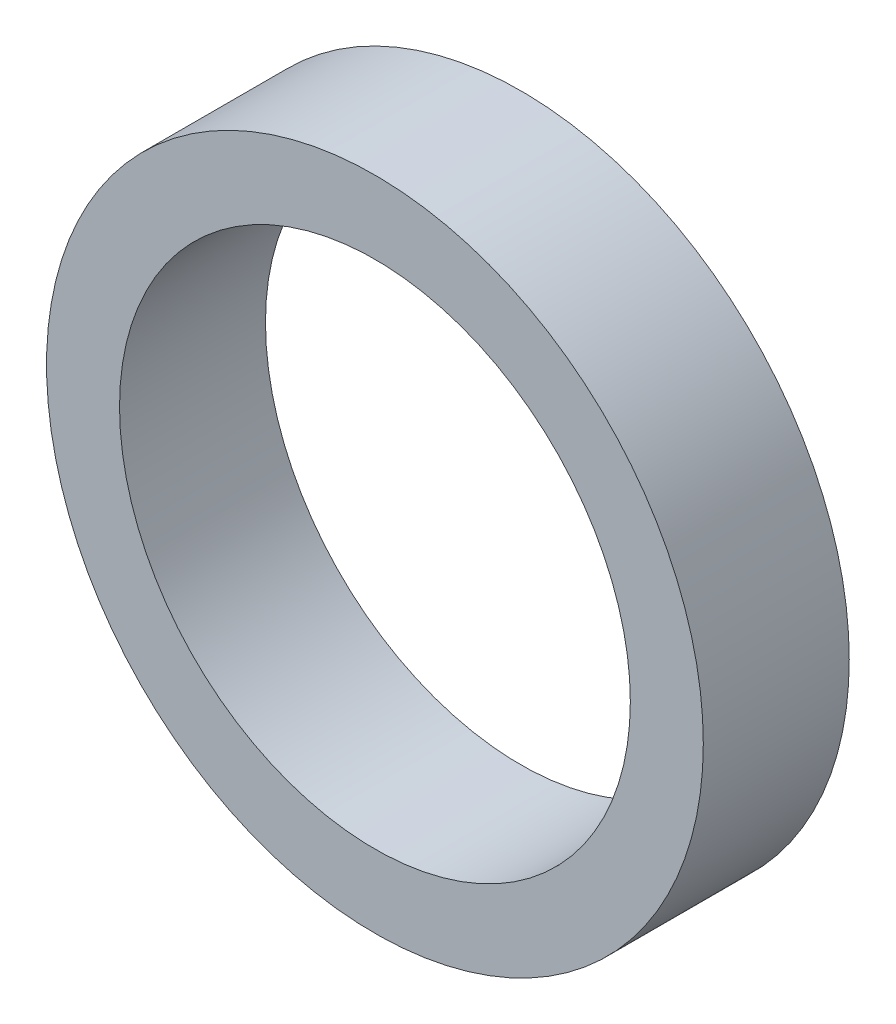
ISO-10303-21;
HEADER;
FILE_DESCRIPTION(('STEP AP214'),'2;1');
FILE_NAME('part.step','',(''),(''),'','','');
FILE_SCHEMA(('AUTOMOTIVE_DESIGN { 1 0 10303 214 1 1 1 1 }'));
ENDSEC;
DATA;
#1=APPLICATION_CONTEXT('core data for automotive mechanical design processes');
#2=APPLICATION_PROTOCOL_DEFINITION('international standard','automotive_design',2000,#1);
#3=PRODUCT_CONTEXT('',#1,'mechanical');
#4=PRODUCT('Part','Part','',(#3));
#5=PRODUCT_RELATED_PRODUCT_CATEGORY('part','',(#4));
#6=PRODUCT_DEFINITION_FORMATION('','',#4);
#7=PRODUCT_DEFINITION_CONTEXT('part definition',#1,'design');
#8=PRODUCT_DEFINITION('design','',#6,#7);
#9=PRODUCT_DEFINITION_SHAPE('','',#8);
#10=(LENGTH_UNIT() NAMED_UNIT(*) SI_UNIT(.MILLI.,.METRE.));
#11=(NAMED_UNIT(*) PLANE_ANGLE_UNIT() SI_UNIT($,.RADIAN.));
#12=(NAMED_UNIT(*) SI_UNIT($,.STERADIAN.) SOLID_ANGLE_UNIT());
#13=UNCERTAINTY_MEASURE_WITH_UNIT(LENGTH_MEASURE(1.E-05),#10,'distance_accuracy_value','');
#14=(GEOMETRIC_REPRESENTATION_CONTEXT(3) GLOBAL_UNCERTAINTY_ASSIGNED_CONTEXT((#13)) GLOBAL_UNIT_ASSIGNED_CONTEXT((#10,
#11,#12)) REPRESENTATION_CONTEXT('',''));
#15=CARTESIAN_POINT('',(0.,0.,0.));
#16=DIRECTION('',(0.,0.,1.));
#17=DIRECTION('',(1.,0.,0.));
#18=AXIS2_PLACEMENT_3D('',#15,#16,#17);
#19=CARTESIAN_POINT('',(0.,0.,10.));
#20=DIRECTION('',(0.,0.,1.));
#21=DIRECTION('',(1.,0.,0.));
#22=AXIS2_PLACEMENT_3D('',#19,#20,#21);
#23=PLANE('',#22);
#24=CARTESIAN_POINT('',(0.,0.,10.));
#25=DIRECTION('',(0.,0.,1.));
#26=DIRECTION('',(1.,0.,0.));
#27=AXIS2_PLACEMENT_3D('',#24,#25,#26);
#28=CIRCLE('',#27,22.5);
#29=CARTESIAN_POINT('',(22.5,0.,10.));
#30=VERTEX_POINT('',#29);
#31=EDGE_CURVE('E10',#30,#30,#28,.T.);
#32=ORIENTED_EDGE('',*,*,#31,.T.);
#33=EDGE_LOOP('',(#32));
#34=FACE_BOUND('',#33,.T.);
#35=CARTESIAN_POINT('',(0.,0.,10.));
#36=DIRECTION('',(0.,0.,1.));
#37=DIRECTION('',(1.,0.,0.));
#38=AXIS2_PLACEMENT_3D('',#35,#36,#37);
#39=CIRCLE('',#38,17.5);
#40=CARTESIAN_POINT('',(17.5,0.,10.));
#41=VERTEX_POINT('',#40);
#42=EDGE_CURVE('E50',#41,#41,#39,.T.);
#43=ORIENTED_EDGE('',*,*,#42,.F.);
#44=EDGE_LOOP('',(#43));
#45=FACE_BOUND('',#44,.T.);
#46=ADVANCED_FACE('F37',(#34,#45),#23,.T.);
#47=CARTESIAN_POINT('',(0.,0.,0.));
#48=DIRECTION('',(0.,0.,1.));
#49=DIRECTION('',(1.,0.,0.));
#50=AXIS2_PLACEMENT_3D('',#47,#48,#49);
#51=PLANE('',#50);
#52=CARTESIAN_POINT('',(0.,0.,0.));
#53=DIRECTION('',(0.,0.,1.));
#54=DIRECTION('',(1.,0.,0.));
#55=AXIS2_PLACEMENT_3D('',#52,#53,#54);
#56=CIRCLE('',#55,22.5);
#57=CARTESIAN_POINT('',(22.5,0.,0.));
#58=VERTEX_POINT('',#57);
#59=EDGE_CURVE('E41',#58,#58,#56,.T.);
#60=ORIENTED_EDGE('',*,*,#59,.F.);
#61=EDGE_LOOP('',(#60));
#62=FACE_BOUND('',#61,.T.);
#63=CARTESIAN_POINT('',(0.,0.,0.));
#64=DIRECTION('',(0.,0.,1.));
#65=DIRECTION('',(1.,0.,0.));
#66=AXIS2_PLACEMENT_3D('',#63,#64,#65);
#67=CIRCLE('',#66,17.5);
#68=CARTESIAN_POINT('',(17.5,0.,0.));
#69=VERTEX_POINT('',#68);
#70=EDGE_CURVE('E52',#69,#69,#67,.T.);
#71=ORIENTED_EDGE('',*,*,#70,.T.);
#72=EDGE_LOOP('',(#71));
#73=FACE_BOUND('',#72,.T.);
#74=ADVANCED_FACE('F64',(#62,#73),#51,.F.);
#75=CARTESIAN_POINT('',(0.,0.,10.));
#76=DIRECTION('',(0.,0.,-1.));
#77=DIRECTION('',(-1.,0.,0.));
#78=AXIS2_PLACEMENT_3D('',#75,#76,#77);
#79=CYLINDRICAL_SURFACE('',#78,22.5);
#80=ORIENTED_EDGE('',*,*,#31,.F.);
#81=EDGE_LOOP('',(#80));
#82=FACE_BOUND('',#81,.T.);
#83=ORIENTED_EDGE('',*,*,#59,.T.);
#84=EDGE_LOOP('',(#83));
#85=FACE_BOUND('',#84,.T.);
#86=ADVANCED_FACE('F39',(#82,#85),#79,.T.);
#87=CARTESIAN_POINT('',(0.,0.,10.));
#88=DIRECTION('',(0.,0.,-1.));
#89=DIRECTION('',(-1.,0.,0.));
#90=AXIS2_PLACEMENT_3D('',#87,#88,#89);
#91=CYLINDRICAL_SURFACE('',#90,17.5);
#92=ORIENTED_EDGE('',*,*,#42,.T.);
#93=EDGE_LOOP('',(#92));
#94=FACE_BOUND('',#93,.T.);
#95=ORIENTED_EDGE('',*,*,#70,.F.);
#96=EDGE_LOOP('',(#95));
#97=FACE_BOUND('',#96,.T.);
#98=ADVANCED_FACE('F60',(#94,#97),#91,.F.);
#99=CLOSED_SHELL('',(#46,#74,#86,#98));
#100=MANIFOLD_SOLID_BREP('B2',#99);
#101=ADVANCED_BREP_SHAPE_REPRESENTATION('',(#18,#100),#14);
#102=SHAPE_DEFINITION_REPRESENTATION(#9,#101);
ENDSEC;
END-ISO-10303-21;
